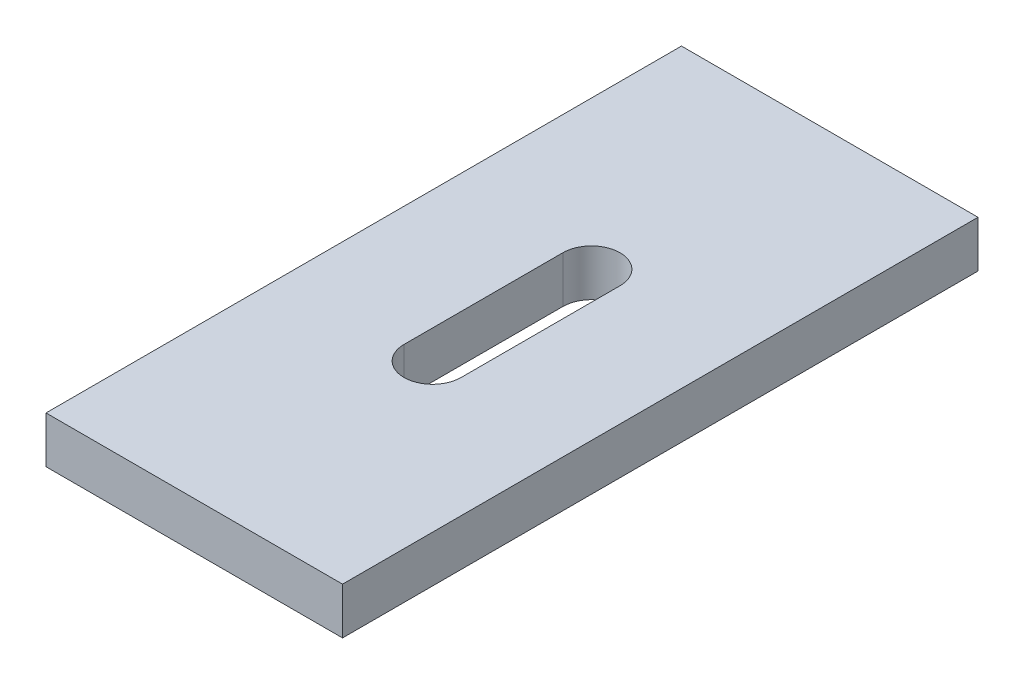
ISO-10303-21;
HEADER;
FILE_DESCRIPTION(('STEP AP214'),'2;1');
FILE_NAME('part.step','',(''),(''),'','','');
FILE_SCHEMA(('AUTOMOTIVE_DESIGN { 1 0 10303 214 1 1 1 1 }'));
ENDSEC;
DATA;
#1=APPLICATION_CONTEXT('core data for automotive mechanical design processes');
#2=APPLICATION_PROTOCOL_DEFINITION('international standard','automotive_design',2000,#1);
#3=PRODUCT_CONTEXT('',#1,'mechanical');
#4=PRODUCT('Part','Part','',(#3));
#5=PRODUCT_RELATED_PRODUCT_CATEGORY('part','',(#4));
#6=PRODUCT_DEFINITION_FORMATION('','',#4);
#7=PRODUCT_DEFINITION_CONTEXT('part definition',#1,'design');
#8=PRODUCT_DEFINITION('design','',#6,#7);
#9=PRODUCT_DEFINITION_SHAPE('','',#8);
#10=(LENGTH_UNIT() NAMED_UNIT(*) SI_UNIT(.MILLI.,.METRE.));
#11=(NAMED_UNIT(*) PLANE_ANGLE_UNIT() SI_UNIT($,.RADIAN.));
#12=(NAMED_UNIT(*) SI_UNIT($,.STERADIAN.) SOLID_ANGLE_UNIT());
#13=UNCERTAINTY_MEASURE_WITH_UNIT(LENGTH_MEASURE(1.E-05),#10,'distance_accuracy_value','');
#14=(GEOMETRIC_REPRESENTATION_CONTEXT(3) GLOBAL_UNCERTAINTY_ASSIGNED_CONTEXT((#13)) GLOBAL_UNIT_ASSIGNED_CONTEXT((#10,
#11,#12)) REPRESENTATION_CONTEXT('',''));
#15=CARTESIAN_POINT('',(0.,0.,0.));
#16=DIRECTION('',(0.,0.,1.));
#17=DIRECTION('',(1.,0.,0.));
#18=AXIS2_PLACEMENT_3D('',#15,#16,#17);
#19=CARTESIAN_POINT('',(-8.89,1.397,19.05));
#20=DIRECTION('',(1.,0.,0.));
#21=DIRECTION('',(0.,0.,-1.));
#22=AXIS2_PLACEMENT_3D('',#19,#20,#21);
#23=PLANE('',#22);
#24=DIRECTION('',(0.,-1.,0.));
#25=VECTOR('',#24,1.);
#26=CARTESIAN_POINT('',(-8.89,1.397,-19.05));
#27=LINE('',#26,#25);
#28=CARTESIAN_POINT('',(-8.89,1.397,-19.05));
#29=VERTEX_POINT('',#28);
#30=CARTESIAN_POINT('',(-8.89,-1.397,-19.05));
#31=VERTEX_POINT('',#30);
#32=EDGE_CURVE('E130',#29,#31,#27,.T.);
#33=ORIENTED_EDGE('',*,*,#32,.T.);
#34=DIRECTION('',(0.,0.,-1.));
#35=VECTOR('',#34,1.);
#36=CARTESIAN_POINT('',(-8.89,-1.397,19.05));
#37=LINE('',#36,#35);
#38=CARTESIAN_POINT('',(-8.89,-1.397,19.05));
#39=VERTEX_POINT('',#38);
#40=EDGE_CURVE('E11',#39,#31,#37,.T.);
#41=ORIENTED_EDGE('',*,*,#40,.F.);
#42=DIRECTION('',(0.,-1.,0.));
#43=VECTOR('',#42,1.);
#44=CARTESIAN_POINT('',(-8.89,1.397,19.05));
#45=LINE('',#44,#43);
#46=CARTESIAN_POINT('',(-8.89,1.397,19.05));
#47=VERTEX_POINT('',#46);
#48=EDGE_CURVE('E134',#47,#39,#45,.T.);
#49=ORIENTED_EDGE('',*,*,#48,.F.);
#50=DIRECTION('',(0.,0.,-1.));
#51=VECTOR('',#50,1.);
#52=CARTESIAN_POINT('',(-8.89,1.397,19.05));
#53=LINE('',#52,#51);
#54=EDGE_CURVE('E144',#47,#29,#53,.T.);
#55=ORIENTED_EDGE('',*,*,#54,.T.);
#56=EDGE_LOOP('',(#33,#41,#49,#55));
#57=FACE_BOUND('',#56,.T.);
#58=ADVANCED_FACE('F33',(#57),#23,.F.);
#59=CARTESIAN_POINT('',(8.89,-1.397,19.05));
#60=DIRECTION('',(0.,1.,0.));
#61=DIRECTION('',(-1.,0.,0.));
#62=AXIS2_PLACEMENT_3D('',#59,#60,#61);
#63=PLANE('',#62);
#64=DIRECTION('',(0.,0.,1.));
#65=VECTOR('',#64,1.);
#66=CARTESIAN_POINT('',(-1.7145,-1.397,4.7625));
#67=LINE('',#66,#65);
#68=CARTESIAN_POINT('',(-1.71450000000001,-1.397,-4.7625));
#69=VERTEX_POINT('',#68);
#70=CARTESIAN_POINT('',(-1.7145,-1.397,4.7625));
#71=VERTEX_POINT('',#70);
#72=EDGE_CURVE('E105',#69,#71,#67,.T.);
#73=ORIENTED_EDGE('',*,*,#72,.T.);
#74=CARTESIAN_POINT('',(0.,-1.397,4.7625));
#75=DIRECTION('',(0.,1.,0.));
#76=DIRECTION('',(-1.,0.,0.));
#77=AXIS2_PLACEMENT_3D('',#74,#75,#76);
#78=CIRCLE('',#77,1.7145);
#79=CARTESIAN_POINT('',(1.7145,-1.397,4.7625));
#80=VERTEX_POINT('',#79);
#81=EDGE_CURVE('E99',#71,#80,#78,.T.);
#82=ORIENTED_EDGE('',*,*,#81,.T.);
#83=DIRECTION('',(0.,0.,-1.));
#84=VECTOR('',#83,1.);
#85=CARTESIAN_POINT('',(1.7145,-1.397,4.7625));
#86=LINE('',#85,#84);
#87=CARTESIAN_POINT('',(1.7145,-1.397,-4.7625));
#88=VERTEX_POINT('',#87);
#89=EDGE_CURVE('E108',#80,#88,#86,.T.);
#90=ORIENTED_EDGE('',*,*,#89,.T.);
#91=CARTESIAN_POINT('',(0.,-1.397,-4.7625));
#92=DIRECTION('',(0.,1.,0.));
#93=DIRECTION('',(-1.,0.,0.));
#94=AXIS2_PLACEMENT_3D('',#91,#92,#93);
#95=CIRCLE('',#94,1.7145);
#96=EDGE_CURVE('E47',#88,#69,#95,.T.);
#97=ORIENTED_EDGE('',*,*,#96,.T.);
#98=EDGE_LOOP('',(#73,#82,#90,#97));
#99=FACE_BOUND('',#98,.T.);
#100=DIRECTION('',(1.,0.,0.));
#101=VECTOR('',#100,1.);
#102=CARTESIAN_POINT('',(8.89,-1.397,-19.05));
#103=LINE('',#102,#101);
#104=CARTESIAN_POINT('',(8.89,-1.397,-19.05));
#105=VERTEX_POINT('',#104);
#106=EDGE_CURVE('E147',#31,#105,#103,.T.);
#107=ORIENTED_EDGE('',*,*,#106,.T.);
#108=DIRECTION('',(0.,0.,-1.));
#109=VECTOR('',#108,1.);
#110=CARTESIAN_POINT('',(8.89,-1.397,19.05));
#111=LINE('',#110,#109);
#112=CARTESIAN_POINT('',(8.89,-1.397,19.05));
#113=VERTEX_POINT('',#112);
#114=EDGE_CURVE('E40',#113,#105,#111,.T.);
#115=ORIENTED_EDGE('',*,*,#114,.F.);
#116=DIRECTION('',(1.,0.,0.));
#117=VECTOR('',#116,1.);
#118=CARTESIAN_POINT('',(8.89,-1.397,19.05));
#119=LINE('',#118,#117);
#120=EDGE_CURVE('E137',#39,#113,#119,.T.);
#121=ORIENTED_EDGE('',*,*,#120,.F.);
#122=ORIENTED_EDGE('',*,*,#40,.T.);
#123=EDGE_LOOP('',(#107,#115,#121,#122));
#124=FACE_BOUND('',#123,.T.);
#125=ADVANCED_FACE('F112',(#99,#124),#63,.F.);
#126=CARTESIAN_POINT('',(8.89,1.397,19.05));
#127=DIRECTION('',(-1.,0.,0.));
#128=DIRECTION('',(0.,0.,1.));
#129=AXIS2_PLACEMENT_3D('',#126,#127,#128);
#130=PLANE('',#129);
#131=DIRECTION('',(0.,1.,0.));
#132=VECTOR('',#131,1.);
#133=CARTESIAN_POINT('',(8.89,1.397,-19.05));
#134=LINE('',#133,#132);
#135=CARTESIAN_POINT('',(8.89,1.397,-19.05));
#136=VERTEX_POINT('',#135);
#137=EDGE_CURVE('E149',#105,#136,#134,.T.);
#138=ORIENTED_EDGE('',*,*,#137,.T.);
#139=DIRECTION('',(0.,0.,-1.));
#140=VECTOR('',#139,1.);
#141=CARTESIAN_POINT('',(8.89,1.397,19.05));
#142=LINE('',#141,#140);
#143=CARTESIAN_POINT('',(8.89,1.397,19.05));
#144=VERTEX_POINT('',#143);
#145=EDGE_CURVE('E154',#144,#136,#142,.T.);
#146=ORIENTED_EDGE('',*,*,#145,.F.);
#147=DIRECTION('',(0.,1.,0.));
#148=VECTOR('',#147,1.);
#149=CARTESIAN_POINT('',(8.89,1.397,19.05));
#150=LINE('',#149,#148);
#151=EDGE_CURVE('E140',#113,#144,#150,.T.);
#152=ORIENTED_EDGE('',*,*,#151,.F.);
#153=ORIENTED_EDGE('',*,*,#114,.T.);
#154=EDGE_LOOP('',(#138,#146,#152,#153));
#155=FACE_BOUND('',#154,.T.);
#156=ADVANCED_FACE('F161',(#155),#130,.F.);
#157=CARTESIAN_POINT('',(8.89,1.397,19.05));
#158=DIRECTION('',(0.,-1.,0.));
#159=DIRECTION('',(1.,0.,0.));
#160=AXIS2_PLACEMENT_3D('',#157,#158,#159);
#161=PLANE('',#160);
#162=DIRECTION('',(0.,0.,-1.));
#163=VECTOR('',#162,1.);
#164=CARTESIAN_POINT('',(1.7145,1.397,4.7625));
#165=LINE('',#164,#163);
#166=CARTESIAN_POINT('',(1.7145,1.397,4.7625));
#167=VERTEX_POINT('',#166);
#168=CARTESIAN_POINT('',(1.7145,1.397,-4.7625));
#169=VERTEX_POINT('',#168);
#170=EDGE_CURVE('E124',#167,#169,#165,.T.);
#171=ORIENTED_EDGE('',*,*,#170,.F.);
#172=CARTESIAN_POINT('',(0.,1.397,4.7625));
#173=DIRECTION('',(0.,1.,0.));
#174=DIRECTION('',(-1.,0.,0.));
#175=AXIS2_PLACEMENT_3D('',#172,#173,#174);
#176=CIRCLE('',#175,1.7145);
#177=CARTESIAN_POINT('',(-1.7145,1.397,4.7625));
#178=VERTEX_POINT('',#177);
#179=EDGE_CURVE('E55',#178,#167,#176,.T.);
#180=ORIENTED_EDGE('',*,*,#179,.F.);
#181=DIRECTION('',(0.,0.,1.));
#182=VECTOR('',#181,1.);
#183=CARTESIAN_POINT('',(-1.7145,1.397,4.7625));
#184=LINE('',#183,#182);
#185=CARTESIAN_POINT('',(-1.71450000000001,1.397,-4.7625));
#186=VERTEX_POINT('',#185);
#187=EDGE_CURVE('E115',#186,#178,#184,.T.);
#188=ORIENTED_EDGE('',*,*,#187,.F.);
#189=CARTESIAN_POINT('',(0.,1.397,-4.7625));
#190=DIRECTION('',(0.,1.,0.));
#191=DIRECTION('',(-1.,0.,0.));
#192=AXIS2_PLACEMENT_3D('',#189,#190,#191);
#193=CIRCLE('',#192,1.7145);
#194=EDGE_CURVE('E118',#169,#186,#193,.T.);
#195=ORIENTED_EDGE('',*,*,#194,.F.);
#196=EDGE_LOOP('',(#171,#180,#188,#195));
#197=FACE_BOUND('',#196,.T.);
#198=DIRECTION('',(-1.,0.,0.));
#199=VECTOR('',#198,1.);
#200=CARTESIAN_POINT('',(8.89,1.397,-19.05));
#201=LINE('',#200,#199);
#202=EDGE_CURVE('E138',#136,#29,#201,.T.);
#203=ORIENTED_EDGE('',*,*,#202,.T.);
#204=ORIENTED_EDGE('',*,*,#54,.F.);
#205=DIRECTION('',(-1.,0.,0.));
#206=VECTOR('',#205,1.);
#207=CARTESIAN_POINT('',(8.89,1.397,19.05));
#208=LINE('',#207,#206);
#209=EDGE_CURVE('E142',#144,#47,#208,.T.);
#210=ORIENTED_EDGE('',*,*,#209,.F.);
#211=ORIENTED_EDGE('',*,*,#145,.T.);
#212=EDGE_LOOP('',(#203,#204,#210,#211));
#213=FACE_BOUND('',#212,.T.);
#214=ADVANCED_FACE('F169',(#197,#213),#161,.F.);
#215=CARTESIAN_POINT('',(0.,0.,19.05));
#216=DIRECTION('',(0.,0.,-1.));
#217=DIRECTION('',(-1.,0.,0.));
#218=AXIS2_PLACEMENT_3D('',#215,#216,#217);
#219=PLANE('',#218);
#220=ORIENTED_EDGE('',*,*,#48,.T.);
#221=ORIENTED_EDGE('',*,*,#120,.T.);
#222=ORIENTED_EDGE('',*,*,#151,.T.);
#223=ORIENTED_EDGE('',*,*,#209,.T.);
#224=EDGE_LOOP('',(#220,#221,#222,#223));
#225=FACE_BOUND('',#224,.T.);
#226=ADVANCED_FACE('F175',(#225),#219,.F.);
#227=CARTESIAN_POINT('',(0.,0.,-19.05));
#228=DIRECTION('',(0.,0.,-1.));
#229=DIRECTION('',(-1.,0.,0.));
#230=AXIS2_PLACEMENT_3D('',#227,#228,#229);
#231=PLANE('',#230);
#232=ORIENTED_EDGE('',*,*,#32,.F.);
#233=ORIENTED_EDGE('',*,*,#202,.F.);
#234=ORIENTED_EDGE('',*,*,#137,.F.);
#235=ORIENTED_EDGE('',*,*,#106,.F.);
#236=EDGE_LOOP('',(#232,#233,#234,#235));
#237=FACE_BOUND('',#236,.T.);
#238=ADVANCED_FACE('F166',(#237),#231,.T.);
#239=CARTESIAN_POINT('',(0.,-1.397,4.7625));
#240=DIRECTION('',(0.,1.,0.));
#241=DIRECTION('',(-1.,0.,0.));
#242=AXIS2_PLACEMENT_3D('',#239,#240,#241);
#243=CYLINDRICAL_SURFACE('',#242,1.7145);
#244=ORIENTED_EDGE('',*,*,#179,.T.);
#245=DIRECTION('',(0.,1.,0.));
#246=VECTOR('',#245,1.);
#247=CARTESIAN_POINT('',(1.7145,-1.397,4.7625));
#248=LINE('',#247,#246);
#249=EDGE_CURVE('E95',#80,#167,#248,.T.);
#250=ORIENTED_EDGE('',*,*,#249,.F.);
#251=ORIENTED_EDGE('',*,*,#81,.F.);
#252=DIRECTION('',(0.,1.,0.));
#253=VECTOR('',#252,1.);
#254=CARTESIAN_POINT('',(-1.7145,-1.397,4.7625));
#255=LINE('',#254,#253);
#256=EDGE_CURVE('E128',#71,#178,#255,.T.);
#257=ORIENTED_EDGE('',*,*,#256,.T.);
#258=EDGE_LOOP('',(#244,#250,#251,#257));
#259=FACE_BOUND('',#258,.T.);
#260=ADVANCED_FACE('F97',(#259),#243,.F.);
#261=CARTESIAN_POINT('',(-1.7145,-1.397,4.7625));
#262=DIRECTION('',(-1.,0.,0.));
#263=DIRECTION('',(0.,0.,1.));
#264=AXIS2_PLACEMENT_3D('',#261,#262,#263);
#265=PLANE('',#264);
#266=ORIENTED_EDGE('',*,*,#187,.T.);
#267=ORIENTED_EDGE('',*,*,#256,.F.);
#268=ORIENTED_EDGE('',*,*,#72,.F.);
#269=DIRECTION('',(0.,1.,0.));
#270=VECTOR('',#269,1.);
#271=CARTESIAN_POINT('',(-1.71450000000001,-1.397,-4.7625));
#272=LINE('',#271,#270);
#273=EDGE_CURVE('E131',#69,#186,#272,.T.);
#274=ORIENTED_EDGE('',*,*,#273,.T.);
#275=EDGE_LOOP('',(#266,#267,#268,#274));
#276=FACE_BOUND('',#275,.T.);
#277=ADVANCED_FACE('F192',(#276),#265,.F.);
#278=CARTESIAN_POINT('',(0.,-1.397,-4.7625));
#279=DIRECTION('',(0.,1.,0.));
#280=DIRECTION('',(-1.,0.,0.));
#281=AXIS2_PLACEMENT_3D('',#278,#279,#280);
#282=CYLINDRICAL_SURFACE('',#281,1.7145);
#283=ORIENTED_EDGE('',*,*,#194,.T.);
#284=ORIENTED_EDGE('',*,*,#273,.F.);
#285=ORIENTED_EDGE('',*,*,#96,.F.);
#286=DIRECTION('',(0.,1.,0.));
#287=VECTOR('',#286,1.);
#288=CARTESIAN_POINT('',(1.7145,-1.397,-4.7625));
#289=LINE('',#288,#287);
#290=EDGE_CURVE('E104',#88,#169,#289,.T.);
#291=ORIENTED_EDGE('',*,*,#290,.T.);
#292=EDGE_LOOP('',(#283,#284,#285,#291));
#293=FACE_BOUND('',#292,.T.);
#294=ADVANCED_FACE('F195',(#293),#282,.F.);
#295=CARTESIAN_POINT('',(1.7145,-1.397,4.7625));
#296=DIRECTION('',(1.,0.,0.));
#297=DIRECTION('',(0.,0.,-1.));
#298=AXIS2_PLACEMENT_3D('',#295,#296,#297);
#299=PLANE('',#298);
#300=ORIENTED_EDGE('',*,*,#170,.T.);
#301=ORIENTED_EDGE('',*,*,#290,.F.);
#302=ORIENTED_EDGE('',*,*,#89,.F.);
#303=ORIENTED_EDGE('',*,*,#249,.T.);
#304=EDGE_LOOP('',(#300,#301,#302,#303));
#305=FACE_BOUND('',#304,.T.);
#306=ADVANCED_FACE('F109',(#305),#299,.F.);
#307=CLOSED_SHELL('',(#58,#125,#156,#214,#226,#238,#260,#277,#294,#306));
#308=MANIFOLD_SOLID_BREP('B2',#307);
#309=ADVANCED_BREP_SHAPE_REPRESENTATION('',(#18,#308),#14);
#310=SHAPE_DEFINITION_REPRESENTATION(#9,#309);
ENDSEC;
END-ISO-10303-21;
